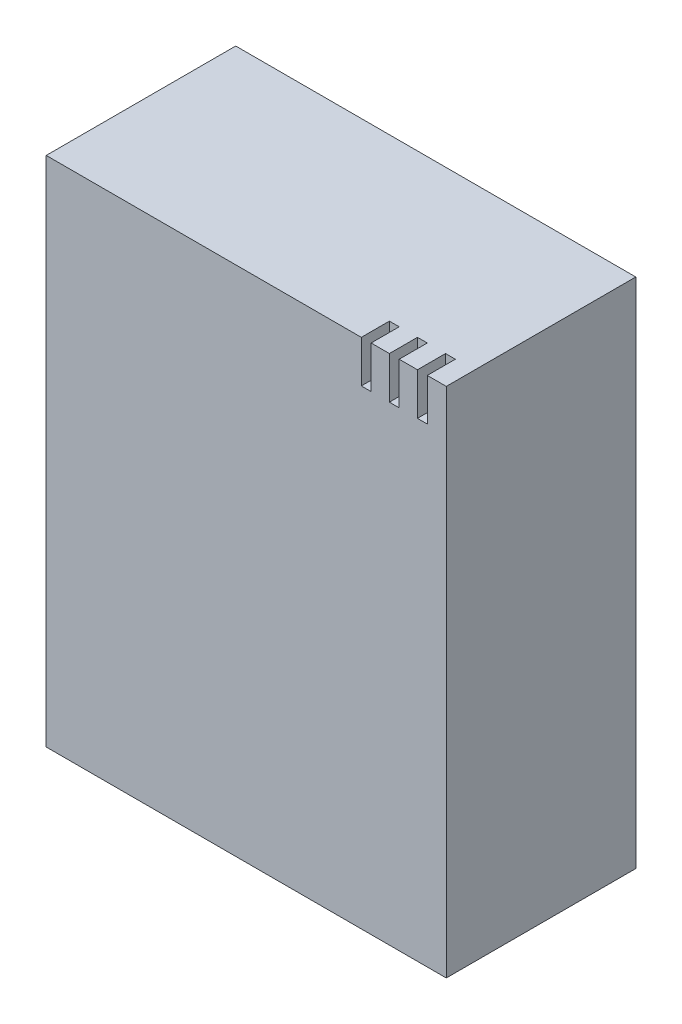
ISO-10303-21;
HEADER;
FILE_DESCRIPTION(('STEP AP214'),'2;1');
FILE_NAME('part.step','',(''),(''),'','','');
FILE_SCHEMA(('AUTOMOTIVE_DESIGN { 1 0 10303 214 1 1 1 1 }'));
ENDSEC;
DATA;
#1=APPLICATION_CONTEXT('core data for automotive mechanical design processes');
#2=APPLICATION_PROTOCOL_DEFINITION('international standard','automotive_design',2000,#1);
#3=PRODUCT_CONTEXT('',#1,'mechanical');
#4=PRODUCT('Part','Part','',(#3));
#5=PRODUCT_RELATED_PRODUCT_CATEGORY('part','',(#4));
#6=PRODUCT_DEFINITION_FORMATION('','',#4);
#7=PRODUCT_DEFINITION_CONTEXT('part definition',#1,'design');
#8=PRODUCT_DEFINITION('design','',#6,#7);
#9=PRODUCT_DEFINITION_SHAPE('','',#8);
#10=(LENGTH_UNIT() NAMED_UNIT(*) SI_UNIT(.MILLI.,.METRE.));
#11=(NAMED_UNIT(*) PLANE_ANGLE_UNIT() SI_UNIT($,.RADIAN.));
#12=(NAMED_UNIT(*) SI_UNIT($,.STERADIAN.) SOLID_ANGLE_UNIT());
#13=UNCERTAINTY_MEASURE_WITH_UNIT(LENGTH_MEASURE(1.E-05),#10,'distance_accuracy_value','');
#14=(GEOMETRIC_REPRESENTATION_CONTEXT(3) GLOBAL_UNCERTAINTY_ASSIGNED_CONTEXT((#13)) GLOBAL_UNIT_ASSIGNED_CONTEXT((#10,
#11,#12)) REPRESENTATION_CONTEXT('',''));
#15=CARTESIAN_POINT('',(0.,0.,0.));
#16=DIRECTION('',(0.,0.,1.));
#17=DIRECTION('',(1.,0.,0.));
#18=AXIS2_PLACEMENT_3D('',#15,#16,#17);
#19=CARTESIAN_POINT('',(14.25,36.5,6.75));
#20=DIRECTION('',(-1.,0.,0.));
#21=DIRECTION('',(0.,0.,1.));
#22=AXIS2_PLACEMENT_3D('',#19,#20,#21);
#23=PLANE('',#22);
#24=DIRECTION('',(0.,0.,-1.));
#25=VECTOR('',#24,1.);
#26=CARTESIAN_POINT('',(14.25,0.,6.75));
#27=LINE('',#26,#25);
#28=CARTESIAN_POINT('',(14.25,0.,6.75));
#29=VERTEX_POINT('',#28);
#30=CARTESIAN_POINT('',(14.25,0.,-6.75));
#31=VERTEX_POINT('',#30);
#32=EDGE_CURVE('E225',#29,#31,#27,.T.);
#33=ORIENTED_EDGE('',*,*,#32,.T.);
#34=DIRECTION('',(0.,-1.,0.));
#35=VECTOR('',#34,1.);
#36=CARTESIAN_POINT('',(14.25,36.5,-6.75));
#37=LINE('',#36,#35);
#38=CARTESIAN_POINT('',(14.25,36.5,-6.75));
#39=VERTEX_POINT('',#38);
#40=EDGE_CURVE('E11',#39,#31,#37,.T.);
#41=ORIENTED_EDGE('',*,*,#40,.F.);
#42=DIRECTION('',(0.,0.,-1.));
#43=VECTOR('',#42,1.);
#44=CARTESIAN_POINT('',(14.25,36.5,6.75));
#45=LINE('',#44,#43);
#46=CARTESIAN_POINT('',(14.25,36.5,6.75));
#47=VERTEX_POINT('',#46);
#48=EDGE_CURVE('E233',#47,#39,#45,.T.);
#49=ORIENTED_EDGE('',*,*,#48,.F.);
#50=DIRECTION('',(0.,-1.,0.));
#51=VECTOR('',#50,1.);
#52=CARTESIAN_POINT('',(14.25,36.5,6.75));
#53=LINE('',#52,#51);
#54=EDGE_CURVE('E245',#47,#29,#53,.T.);
#55=ORIENTED_EDGE('',*,*,#54,.T.);
#56=EDGE_LOOP('',(#33,#41,#49,#55));
#57=FACE_BOUND('',#56,.T.);
#58=ADVANCED_FACE('F33',(#57),#23,.F.);
#59=CARTESIAN_POINT('',(-14.25,36.5,-6.75));
#60=DIRECTION('',(0.,0.,1.));
#61=DIRECTION('',(1.,0.,0.));
#62=AXIS2_PLACEMENT_3D('',#59,#60,#61);
#63=PLANE('',#62);
#64=DIRECTION('',(-1.,0.,0.));
#65=VECTOR('',#64,1.);
#66=CARTESIAN_POINT('',(-14.25,0.,-6.75));
#67=LINE('',#66,#65);
#68=CARTESIAN_POINT('',(-14.25,0.,-6.75));
#69=VERTEX_POINT('',#68);
#70=EDGE_CURVE('E248',#31,#69,#67,.T.);
#71=ORIENTED_EDGE('',*,*,#70,.T.);
#72=DIRECTION('',(0.,-1.,0.));
#73=VECTOR('',#72,1.);
#74=CARTESIAN_POINT('',(-14.25,36.5,-6.75));
#75=LINE('',#74,#73);
#76=CARTESIAN_POINT('',(-14.25,36.5,-6.75));
#77=VERTEX_POINT('',#76);
#78=EDGE_CURVE('E40',#77,#69,#75,.T.);
#79=ORIENTED_EDGE('',*,*,#78,.F.);
#80=DIRECTION('',(-1.,0.,0.));
#81=VECTOR('',#80,1.);
#82=CARTESIAN_POINT('',(-14.25,36.5,-6.75));
#83=LINE('',#82,#81);
#84=EDGE_CURVE('E236',#39,#77,#83,.T.);
#85=ORIENTED_EDGE('',*,*,#84,.F.);
#86=ORIENTED_EDGE('',*,*,#40,.T.);
#87=EDGE_LOOP('',(#71,#79,#85,#86));
#88=FACE_BOUND('',#87,.T.);
#89=ADVANCED_FACE('F318',(#88),#63,.F.);
#90=CARTESIAN_POINT('',(-14.25,36.5,6.75));
#91=DIRECTION('',(1.,0.,0.));
#92=DIRECTION('',(0.,0.,-1.));
#93=AXIS2_PLACEMENT_3D('',#90,#91,#92);
#94=PLANE('',#93);
#95=DIRECTION('',(0.,0.,1.));
#96=VECTOR('',#95,1.);
#97=CARTESIAN_POINT('',(-14.25,0.,6.75));
#98=LINE('',#97,#96);
#99=CARTESIAN_POINT('',(-14.25,0.,6.75));
#100=VERTEX_POINT('',#99);
#101=EDGE_CURVE('E250',#69,#100,#98,.T.);
#102=ORIENTED_EDGE('',*,*,#101,.T.);
#103=DIRECTION('',(0.,-1.,0.));
#104=VECTOR('',#103,1.);
#105=CARTESIAN_POINT('',(-14.25,36.5,6.75));
#106=LINE('',#105,#104);
#107=CARTESIAN_POINT('',(-14.25,36.5,6.75));
#108=VERTEX_POINT('',#107);
#109=EDGE_CURVE('E255',#108,#100,#106,.T.);
#110=ORIENTED_EDGE('',*,*,#109,.F.);
#111=DIRECTION('',(0.,0.,1.));
#112=VECTOR('',#111,1.);
#113=CARTESIAN_POINT('',(-14.25,36.5,6.75));
#114=LINE('',#113,#112);
#115=EDGE_CURVE('E239',#77,#108,#114,.T.);
#116=ORIENTED_EDGE('',*,*,#115,.F.);
#117=ORIENTED_EDGE('',*,*,#78,.T.);
#118=EDGE_LOOP('',(#102,#110,#116,#117));
#119=FACE_BOUND('',#118,.T.);
#120=ADVANCED_FACE('F262',(#119),#94,.F.);
#121=CARTESIAN_POINT('',(-14.25,36.5,6.75));
#122=DIRECTION('',(0.,0.,-1.));
#123=DIRECTION('',(-1.,0.,0.));
#124=AXIS2_PLACEMENT_3D('',#121,#122,#123);
#125=PLANE('',#124);
#126=DIRECTION('',(1.,0.,0.));
#127=VECTOR('',#126,1.);
#128=CARTESIAN_POINT('',(8.8962485952564,33.5,6.75000000000003));
#129=LINE('',#128,#127);
#130=CARTESIAN_POINT('',(8.1962485952564,33.5,6.75000000000003));
#131=VERTEX_POINT('',#130);
#132=CARTESIAN_POINT('',(8.8962485952564,33.5,6.75000000000003));
#133=VERTEX_POINT('',#132);
#134=EDGE_CURVE('E153',#131,#133,#129,.T.);
#135=ORIENTED_EDGE('',*,*,#134,.F.);
#136=DIRECTION('',(0.,1.,0.));
#137=VECTOR('',#136,1.);
#138=CARTESIAN_POINT('',(8.1962485952564,33.5,6.75000000000003));
#139=LINE('',#138,#137);
#140=CARTESIAN_POINT('',(8.1962485952564,36.5,6.75000000000003));
#141=VERTEX_POINT('',#140);
#142=EDGE_CURVE('E190',#131,#141,#139,.T.);
#143=ORIENTED_EDGE('',*,*,#142,.T.);
#144=DIRECTION('',(1.,0.,0.));
#145=VECTOR('',#144,1.);
#146=CARTESIAN_POINT('',(-14.25,36.5,6.75));
#147=LINE('',#146,#145);
#148=EDGE_CURVE('E242',#108,#141,#147,.T.);
#149=ORIENTED_EDGE('',*,*,#148,.F.);
#150=ORIENTED_EDGE('',*,*,#109,.T.);
#151=DIRECTION('',(1.,0.,0.));
#152=VECTOR('',#151,1.);
#153=CARTESIAN_POINT('',(-14.25,0.,6.75));
#154=LINE('',#153,#152);
#155=EDGE_CURVE('E237',#100,#29,#154,.T.);
#156=ORIENTED_EDGE('',*,*,#155,.T.);
#157=ORIENTED_EDGE('',*,*,#54,.F.);
#158=CARTESIAN_POINT('',(12.8962485952564,36.5,6.75));
#159=VERTEX_POINT('',#158);
#160=EDGE_CURVE('E241',#159,#47,#147,.T.);
#161=ORIENTED_EDGE('',*,*,#160,.F.);
#162=DIRECTION('',(0.,1.,0.));
#163=VECTOR('',#162,1.);
#164=CARTESIAN_POINT('',(12.8962485952564,33.5,6.75));
#165=LINE('',#164,#163);
#166=CARTESIAN_POINT('',(12.8962485952564,33.5,6.75));
#167=VERTEX_POINT('',#166);
#168=EDGE_CURVE('E223',#167,#159,#165,.T.);
#169=ORIENTED_EDGE('',*,*,#168,.F.);
#170=DIRECTION('',(1.,0.,0.));
#171=VECTOR('',#170,1.);
#172=CARTESIAN_POINT('',(12.8962485952564,33.5,6.75));
#173=LINE('',#172,#171);
#174=CARTESIAN_POINT('',(12.1962485952564,33.5,6.75));
#175=VERTEX_POINT('',#174);
#176=EDGE_CURVE('E213',#175,#167,#173,.T.);
#177=ORIENTED_EDGE('',*,*,#176,.F.);
#178=DIRECTION('',(0.,1.,0.));
#179=VECTOR('',#178,1.);
#180=CARTESIAN_POINT('',(12.1962485952564,33.5,6.75));
#181=LINE('',#180,#179);
#182=CARTESIAN_POINT('',(12.1962485952564,36.5,6.75));
#183=VERTEX_POINT('',#182);
#184=EDGE_CURVE('E226',#175,#183,#181,.T.);
#185=ORIENTED_EDGE('',*,*,#184,.T.);
#186=CARTESIAN_POINT('',(10.8962485952564,36.5,6.75));
#187=VERTEX_POINT('',#186);
#188=EDGE_CURVE('E280',#187,#183,#147,.T.);
#189=ORIENTED_EDGE('',*,*,#188,.F.);
#190=DIRECTION('',(0.,1.,0.));
#191=VECTOR('',#190,1.);
#192=CARTESIAN_POINT('',(10.8962485952564,33.5,6.75000000000002));
#193=LINE('',#192,#191);
#194=CARTESIAN_POINT('',(10.8962485952564,33.5,6.75000000000002));
#195=VERTEX_POINT('',#194);
#196=EDGE_CURVE('E55',#195,#187,#193,.T.);
#197=ORIENTED_EDGE('',*,*,#196,.F.);
#198=DIRECTION('',(1.,0.,0.));
#199=VECTOR('',#198,1.);
#200=CARTESIAN_POINT('',(10.8962485952564,33.5,6.75000000000002));
#201=LINE('',#200,#199);
#202=CARTESIAN_POINT('',(10.1962485952564,33.5,6.75000000000002));
#203=VERTEX_POINT('',#202);
#204=EDGE_CURVE('E174',#203,#195,#201,.T.);
#205=ORIENTED_EDGE('',*,*,#204,.F.);
#206=DIRECTION('',(0.,1.,0.));
#207=VECTOR('',#206,1.);
#208=CARTESIAN_POINT('',(10.1962485952564,33.5,6.75000000000002));
#209=LINE('',#208,#207);
#210=CARTESIAN_POINT('',(10.1962485952564,36.5,6.75000000000002));
#211=VERTEX_POINT('',#210);
#212=EDGE_CURVE('E195',#203,#211,#209,.T.);
#213=ORIENTED_EDGE('',*,*,#212,.T.);
#214=CARTESIAN_POINT('',(8.89624859525639,36.5,6.75));
#215=VERTEX_POINT('',#214);
#216=EDGE_CURVE('E167',#215,#211,#147,.T.);
#217=ORIENTED_EDGE('',*,*,#216,.F.);
#218=DIRECTION('',(0.,1.,0.));
#219=VECTOR('',#218,1.);
#220=CARTESIAN_POINT('',(8.8962485952564,33.5,6.75000000000003));
#221=LINE('',#220,#219);
#222=EDGE_CURVE('E47',#133,#215,#221,.T.);
#223=ORIENTED_EDGE('',*,*,#222,.F.);
#224=EDGE_LOOP('',(#135,#143,#149,#150,#156,#157,#161,#169,#177,#185,#189,#197,#205,#213,#217,#223));
#225=FACE_BOUND('',#224,.T.);
#226=ADVANCED_FACE('F165',(#225),#125,.F.);
#227=CARTESIAN_POINT('',(0.,36.5,0.));
#228=DIRECTION('',(0.,-1.,0.));
#229=DIRECTION('',(0.,0.,-1.));
#230=AXIS2_PLACEMENT_3D('',#227,#228,#229);
#231=PLANE('',#230);
#232=ORIENTED_EDGE('',*,*,#148,.T.);
#233=DIRECTION('',(0.,0.,1.));
#234=VECTOR('',#233,1.);
#235=CARTESIAN_POINT('',(8.1962485952564,36.5,6.75000000000003));
#236=LINE('',#235,#234);
#237=CARTESIAN_POINT('',(8.1962485952564,36.5,4.75000000000003));
#238=VERTEX_POINT('',#237);
#239=EDGE_CURVE('E162',#238,#141,#236,.T.);
#240=ORIENTED_EDGE('',*,*,#239,.F.);
#241=DIRECTION('',(-1.,0.,0.));
#242=VECTOR('',#241,1.);
#243=CARTESIAN_POINT('',(8.8962485952564,36.5,4.75000000000003));
#244=LINE('',#243,#242);
#245=CARTESIAN_POINT('',(8.8962485952564,36.5,4.75000000000003));
#246=VERTEX_POINT('',#245);
#247=EDGE_CURVE('E456',#246,#238,#244,.T.);
#248=ORIENTED_EDGE('',*,*,#247,.F.);
#249=DIRECTION('',(0.,0.,-1.));
#250=VECTOR('',#249,1.);
#251=CARTESIAN_POINT('',(8.8962485952564,36.5,6.75000000000003));
#252=LINE('',#251,#250);
#253=EDGE_CURVE('E286',#215,#246,#252,.T.);
#254=ORIENTED_EDGE('',*,*,#253,.F.);
#255=ORIENTED_EDGE('',*,*,#216,.T.);
#256=DIRECTION('',(0.,0.,1.));
#257=VECTOR('',#256,1.);
#258=CARTESIAN_POINT('',(10.1962485952564,36.5,6.75000000000002));
#259=LINE('',#258,#257);
#260=CARTESIAN_POINT('',(10.1962485952564,36.5,4.75000000000001));
#261=VERTEX_POINT('',#260);
#262=EDGE_CURVE('E178',#261,#211,#259,.T.);
#263=ORIENTED_EDGE('',*,*,#262,.F.);
#264=DIRECTION('',(-1.,0.,0.));
#265=VECTOR('',#264,1.);
#266=CARTESIAN_POINT('',(10.8962485952564,36.5,4.75000000000001));
#267=LINE('',#266,#265);
#268=CARTESIAN_POINT('',(10.8962485952564,36.5,4.75000000000001));
#269=VERTEX_POINT('',#268);
#270=EDGE_CURVE('E189',#269,#261,#267,.T.);
#271=ORIENTED_EDGE('',*,*,#270,.F.);
#272=DIRECTION('',(0.,0.,-1.));
#273=VECTOR('',#272,1.);
#274=CARTESIAN_POINT('',(10.8962485952564,36.5,6.75000000000002));
#275=LINE('',#274,#273);
#276=EDGE_CURVE('E187',#187,#269,#275,.T.);
#277=ORIENTED_EDGE('',*,*,#276,.F.);
#278=ORIENTED_EDGE('',*,*,#188,.T.);
#279=DIRECTION('',(0.,0.,1.));
#280=VECTOR('',#279,1.);
#281=CARTESIAN_POINT('',(12.1962485952564,36.5,6.75));
#282=LINE('',#281,#280);
#283=CARTESIAN_POINT('',(12.1962485952564,36.5,4.75));
#284=VERTEX_POINT('',#283);
#285=EDGE_CURVE('E207',#284,#183,#282,.T.);
#286=ORIENTED_EDGE('',*,*,#285,.F.);
#287=DIRECTION('',(-1.,0.,0.));
#288=VECTOR('',#287,1.);
#289=CARTESIAN_POINT('',(12.8962485952564,36.5,4.75));
#290=LINE('',#289,#288);
#291=CARTESIAN_POINT('',(12.8962485952564,36.5,4.75));
#292=VERTEX_POINT('',#291);
#293=EDGE_CURVE('E218',#292,#284,#290,.T.);
#294=ORIENTED_EDGE('',*,*,#293,.F.);
#295=DIRECTION('',(0.,0.,-1.));
#296=VECTOR('',#295,1.);
#297=CARTESIAN_POINT('',(12.8962485952564,36.5,6.75));
#298=LINE('',#297,#296);
#299=EDGE_CURVE('E197',#159,#292,#298,.T.);
#300=ORIENTED_EDGE('',*,*,#299,.F.);
#301=ORIENTED_EDGE('',*,*,#160,.T.);
#302=ORIENTED_EDGE('',*,*,#48,.T.);
#303=ORIENTED_EDGE('',*,*,#84,.T.);
#304=ORIENTED_EDGE('',*,*,#115,.T.);
#305=EDGE_LOOP('',(#232,#240,#248,#254,#255,#263,#271,#277,#278,#286,#294,#300,#301,#302,#303,#304));
#306=FACE_BOUND('',#305,.T.);
#307=ADVANCED_FACE('F276',(#306),#231,.F.);
#308=CARTESIAN_POINT('',(0.,0.,0.));
#309=DIRECTION('',(0.,-1.,0.));
#310=DIRECTION('',(0.,0.,-1.));
#311=AXIS2_PLACEMENT_3D('',#308,#309,#310);
#312=PLANE('',#311);
#313=ORIENTED_EDGE('',*,*,#32,.F.);
#314=ORIENTED_EDGE('',*,*,#155,.F.);
#315=ORIENTED_EDGE('',*,*,#101,.F.);
#316=ORIENTED_EDGE('',*,*,#70,.F.);
#317=EDGE_LOOP('',(#313,#314,#315,#316));
#318=FACE_BOUND('',#317,.T.);
#319=ADVANCED_FACE('F268',(#318),#312,.T.);
#320=CARTESIAN_POINT('',(12.8962485952564,33.5,6.75));
#321=DIRECTION('',(1.,0.,0.));
#322=DIRECTION('',(0.,0.,-1.));
#323=AXIS2_PLACEMENT_3D('',#320,#321,#322);
#324=PLANE('',#323);
#325=ORIENTED_EDGE('',*,*,#299,.T.);
#326=DIRECTION('',(0.,1.,0.));
#327=VECTOR('',#326,1.);
#328=CARTESIAN_POINT('',(12.8962485952564,33.5,4.75));
#329=LINE('',#328,#327);
#330=CARTESIAN_POINT('',(12.8962485952564,33.5,4.75));
#331=VERTEX_POINT('',#330);
#332=EDGE_CURVE('E216',#331,#292,#329,.T.);
#333=ORIENTED_EDGE('',*,*,#332,.F.);
#334=DIRECTION('',(0.,0.,-1.));
#335=VECTOR('',#334,1.);
#336=CARTESIAN_POINT('',(12.8962485952564,33.5,6.75));
#337=LINE('',#336,#335);
#338=EDGE_CURVE('E203',#167,#331,#337,.T.);
#339=ORIENTED_EDGE('',*,*,#338,.F.);
#340=ORIENTED_EDGE('',*,*,#168,.T.);
#341=EDGE_LOOP('',(#325,#333,#339,#340));
#342=FACE_BOUND('',#341,.T.);
#343=ADVANCED_FACE('F306',(#342),#324,.F.);
#344=CARTESIAN_POINT('',(12.1962485952564,33.5,6.75));
#345=DIRECTION('',(-1.,0.,0.));
#346=DIRECTION('',(0.,0.,1.));
#347=AXIS2_PLACEMENT_3D('',#344,#345,#346);
#348=PLANE('',#347);
#349=ORIENTED_EDGE('',*,*,#285,.T.);
#350=ORIENTED_EDGE('',*,*,#184,.F.);
#351=DIRECTION('',(0.,0.,1.));
#352=VECTOR('',#351,1.);
#353=CARTESIAN_POINT('',(12.1962485952564,33.5,6.75));
#354=LINE('',#353,#352);
#355=CARTESIAN_POINT('',(12.1962485952564,33.5,4.75));
#356=VERTEX_POINT('',#355);
#357=EDGE_CURVE('E210',#356,#175,#354,.T.);
#358=ORIENTED_EDGE('',*,*,#357,.F.);
#359=DIRECTION('',(0.,1.,0.));
#360=VECTOR('',#359,1.);
#361=CARTESIAN_POINT('',(12.1962485952564,33.5,4.75));
#362=LINE('',#361,#360);
#363=EDGE_CURVE('E229',#356,#284,#362,.T.);
#364=ORIENTED_EDGE('',*,*,#363,.T.);
#365=EDGE_LOOP('',(#349,#350,#358,#364));
#366=FACE_BOUND('',#365,.T.);
#367=ADVANCED_FACE('F299',(#366),#348,.F.);
#368=CARTESIAN_POINT('',(12.8962485952564,33.5,4.75));
#369=DIRECTION('',(0.,0.,-1.));
#370=DIRECTION('',(-1.,0.,0.));
#371=AXIS2_PLACEMENT_3D('',#368,#369,#370);
#372=PLANE('',#371);
#373=ORIENTED_EDGE('',*,*,#293,.T.);
#374=ORIENTED_EDGE('',*,*,#363,.F.);
#375=DIRECTION('',(-1.,0.,0.));
#376=VECTOR('',#375,1.);
#377=CARTESIAN_POINT('',(12.8962485952564,33.5,4.75));
#378=LINE('',#377,#376);
#379=EDGE_CURVE('E206',#331,#356,#378,.T.);
#380=ORIENTED_EDGE('',*,*,#379,.F.);
#381=ORIENTED_EDGE('',*,*,#332,.T.);
#382=EDGE_LOOP('',(#373,#374,#380,#381));
#383=FACE_BOUND('',#382,.T.);
#384=ADVANCED_FACE('F304',(#383),#372,.F.);
#385=CARTESIAN_POINT('',(0.,33.5,0.));
#386=DIRECTION('',(0.,1.,0.));
#387=DIRECTION('',(0.,0.,1.));
#388=AXIS2_PLACEMENT_3D('',#385,#386,#387);
#389=PLANE('',#388);
#390=ORIENTED_EDGE('',*,*,#338,.T.);
#391=ORIENTED_EDGE('',*,*,#379,.T.);
#392=ORIENTED_EDGE('',*,*,#357,.T.);
#393=ORIENTED_EDGE('',*,*,#176,.T.);
#394=EDGE_LOOP('',(#390,#391,#392,#393));
#395=FACE_BOUND('',#394,.T.);
#396=ADVANCED_FACE('F301',(#395),#389,.T.);
#397=CARTESIAN_POINT('',(10.1962485952564,33.5,6.75000000000002));
#398=DIRECTION('',(-1.,0.,0.));
#399=DIRECTION('',(0.,0.,1.));
#400=AXIS2_PLACEMENT_3D('',#397,#398,#399);
#401=PLANE('',#400);
#402=ORIENTED_EDGE('',*,*,#262,.T.);
#403=ORIENTED_EDGE('',*,*,#212,.F.);
#404=DIRECTION('',(0.,0.,1.));
#405=VECTOR('',#404,1.);
#406=CARTESIAN_POINT('',(10.1962485952564,33.5,6.75000000000002));
#407=LINE('',#406,#405);
#408=CARTESIAN_POINT('',(10.1962485952564,33.5,4.75000000000001));
#409=VERTEX_POINT('',#408);
#410=EDGE_CURVE('E184',#409,#203,#407,.T.);
#411=ORIENTED_EDGE('',*,*,#410,.F.);
#412=DIRECTION('',(0.,1.,0.));
#413=VECTOR('',#412,1.);
#414=CARTESIAN_POINT('',(10.1962485952564,33.5,4.75000000000001));
#415=LINE('',#414,#413);
#416=EDGE_CURVE('E198',#409,#261,#415,.T.);
#417=ORIENTED_EDGE('',*,*,#416,.T.);
#418=EDGE_LOOP('',(#402,#403,#411,#417));
#419=FACE_BOUND('',#418,.T.);
#420=ADVANCED_FACE('F288',(#419),#401,.F.);
#421=CARTESIAN_POINT('',(10.8962485952564,33.5,4.75000000000001));
#422=DIRECTION('',(0.,0.,-1.));
#423=DIRECTION('',(-1.,0.,0.));
#424=AXIS2_PLACEMENT_3D('',#421,#422,#423);
#425=PLANE('',#424);
#426=ORIENTED_EDGE('',*,*,#270,.T.);
#427=ORIENTED_EDGE('',*,*,#416,.F.);
#428=DIRECTION('',(-1.,0.,0.));
#429=VECTOR('',#428,1.);
#430=CARTESIAN_POINT('',(10.8962485952564,33.5,4.75000000000001));
#431=LINE('',#430,#429);
#432=CARTESIAN_POINT('',(10.8962485952564,33.5,4.75000000000001));
#433=VERTEX_POINT('',#432);
#434=EDGE_CURVE('E181',#433,#409,#431,.T.);
#435=ORIENTED_EDGE('',*,*,#434,.F.);
#436=DIRECTION('',(0.,1.,0.));
#437=VECTOR('',#436,1.);
#438=CARTESIAN_POINT('',(10.8962485952564,33.5,4.75000000000001));
#439=LINE('',#438,#437);
#440=EDGE_CURVE('E200',#433,#269,#439,.T.);
#441=ORIENTED_EDGE('',*,*,#440,.T.);
#442=EDGE_LOOP('',(#426,#427,#435,#441));
#443=FACE_BOUND('',#442,.T.);
#444=ADVANCED_FACE('F295',(#443),#425,.F.);
#445=CARTESIAN_POINT('',(10.8962485952564,33.5,6.75000000000002));
#446=DIRECTION('',(1.,0.,0.));
#447=DIRECTION('',(0.,0.,-1.));
#448=AXIS2_PLACEMENT_3D('',#445,#446,#447);
#449=PLANE('',#448);
#450=ORIENTED_EDGE('',*,*,#276,.T.);
#451=ORIENTED_EDGE('',*,*,#440,.F.);
#452=DIRECTION('',(0.,0.,-1.));
#453=VECTOR('',#452,1.);
#454=CARTESIAN_POINT('',(10.8962485952564,33.5,6.75000000000002));
#455=LINE('',#454,#453);
#456=EDGE_CURVE('E177',#195,#433,#455,.T.);
#457=ORIENTED_EDGE('',*,*,#456,.F.);
#458=ORIENTED_EDGE('',*,*,#196,.T.);
#459=EDGE_LOOP('',(#450,#451,#457,#458));
#460=FACE_BOUND('',#459,.T.);
#461=ADVANCED_FACE('F396',(#460),#449,.F.);
#462=CARTESIAN_POINT('',(0.,33.5,0.));
#463=DIRECTION('',(0.,-1.,0.));
#464=DIRECTION('',(0.,0.,-1.));
#465=AXIS2_PLACEMENT_3D('',#462,#463,#464);
#466=PLANE('',#465);
#467=ORIENTED_EDGE('',*,*,#204,.T.);
#468=ORIENTED_EDGE('',*,*,#456,.T.);
#469=ORIENTED_EDGE('',*,*,#434,.T.);
#470=ORIENTED_EDGE('',*,*,#410,.T.);
#471=EDGE_LOOP('',(#467,#468,#469,#470));
#472=FACE_BOUND('',#471,.T.);
#473=ADVANCED_FACE('F292',(#472),#466,.F.);
#474=CARTESIAN_POINT('',(8.1962485952564,33.5,6.75000000000003));
#475=DIRECTION('',(-1.,0.,0.));
#476=DIRECTION('',(0.,0.,1.));
#477=AXIS2_PLACEMENT_3D('',#474,#475,#476);
#478=PLANE('',#477);
#479=ORIENTED_EDGE('',*,*,#239,.T.);
#480=ORIENTED_EDGE('',*,*,#142,.F.);
#481=DIRECTION('',(0.,0.,1.));
#482=VECTOR('',#481,1.);
#483=CARTESIAN_POINT('',(8.1962485952564,33.5,6.75000000000003));
#484=LINE('',#483,#482);
#485=CARTESIAN_POINT('',(8.1962485952564,33.5,4.75000000000003));
#486=VERTEX_POINT('',#485);
#487=EDGE_CURVE('E159',#486,#131,#484,.T.);
#488=ORIENTED_EDGE('',*,*,#487,.F.);
#489=DIRECTION('',(0.,1.,0.));
#490=VECTOR('',#489,1.);
#491=CARTESIAN_POINT('',(8.1962485952564,33.5,4.75000000000003));
#492=LINE('',#491,#490);
#493=EDGE_CURVE('E169',#486,#238,#492,.T.);
#494=ORIENTED_EDGE('',*,*,#493,.T.);
#495=EDGE_LOOP('',(#479,#480,#488,#494));
#496=FACE_BOUND('',#495,.T.);
#497=ADVANCED_FACE('F411',(#496),#478,.F.);
#498=CARTESIAN_POINT('',(8.8962485952564,33.5,4.75000000000003));
#499=DIRECTION('',(0.,0.,-1.));
#500=DIRECTION('',(-1.,0.,0.));
#501=AXIS2_PLACEMENT_3D('',#498,#499,#500);
#502=PLANE('',#501);
#503=ORIENTED_EDGE('',*,*,#247,.T.);
#504=ORIENTED_EDGE('',*,*,#493,.F.);
#505=DIRECTION('',(-1.,0.,0.));
#506=VECTOR('',#505,1.);
#507=CARTESIAN_POINT('',(8.8962485952564,33.5,4.75000000000003));
#508=LINE('',#507,#506);
#509=CARTESIAN_POINT('',(8.8962485952564,33.5,4.75000000000003));
#510=VERTEX_POINT('',#509);
#511=EDGE_CURVE('E152',#510,#486,#508,.T.);
#512=ORIENTED_EDGE('',*,*,#511,.F.);
#513=DIRECTION('',(0.,1.,0.));
#514=VECTOR('',#513,1.);
#515=CARTESIAN_POINT('',(8.8962485952564,33.5,4.75000000000003));
#516=LINE('',#515,#514);
#517=EDGE_CURVE('E148',#510,#246,#516,.T.);
#518=ORIENTED_EDGE('',*,*,#517,.T.);
#519=EDGE_LOOP('',(#503,#504,#512,#518));
#520=FACE_BOUND('',#519,.T.);
#521=ADVANCED_FACE('F419',(#520),#502,.F.);
#522=CARTESIAN_POINT('',(8.8962485952564,33.5,6.75000000000003));
#523=DIRECTION('',(1.,0.,0.));
#524=DIRECTION('',(0.,0.,-1.));
#525=AXIS2_PLACEMENT_3D('',#522,#523,#524);
#526=PLANE('',#525);
#527=ORIENTED_EDGE('',*,*,#253,.T.);
#528=ORIENTED_EDGE('',*,*,#517,.F.);
#529=DIRECTION('',(0.,0.,-1.));
#530=VECTOR('',#529,1.);
#531=CARTESIAN_POINT('',(8.8962485952564,33.5,6.75000000000003));
#532=LINE('',#531,#530);
#533=EDGE_CURVE('E145',#133,#510,#532,.T.);
#534=ORIENTED_EDGE('',*,*,#533,.F.);
#535=ORIENTED_EDGE('',*,*,#222,.T.);
#536=EDGE_LOOP('',(#527,#528,#534,#535));
#537=FACE_BOUND('',#536,.T.);
#538=ADVANCED_FACE('F147',(#537),#526,.F.);
#539=CARTESIAN_POINT('',(0.,33.5,0.));
#540=DIRECTION('',(0.,-1.,0.));
#541=DIRECTION('',(0.,0.,-1.));
#542=AXIS2_PLACEMENT_3D('',#539,#540,#541);
#543=PLANE('',#542);
#544=ORIENTED_EDGE('',*,*,#134,.T.);
#545=ORIENTED_EDGE('',*,*,#533,.T.);
#546=ORIENTED_EDGE('',*,*,#511,.T.);
#547=ORIENTED_EDGE('',*,*,#487,.T.);
#548=EDGE_LOOP('',(#544,#545,#546,#547));
#549=FACE_BOUND('',#548,.T.);
#550=ADVANCED_FACE('F157',(#549),#543,.F.);
#551=CLOSED_SHELL('',(#58,#89,#120,#226,#307,#319,#343,#367,#384,#396,#420,#444,#461,#473,#497,
#521,#538,#550));
#552=MANIFOLD_SOLID_BREP('B2',#551);
#553=ADVANCED_BREP_SHAPE_REPRESENTATION('',(#18,#552),#14);
#554=SHAPE_DEFINITION_REPRESENTATION(#9,#553);
ENDSEC;
END-ISO-10303-21;
